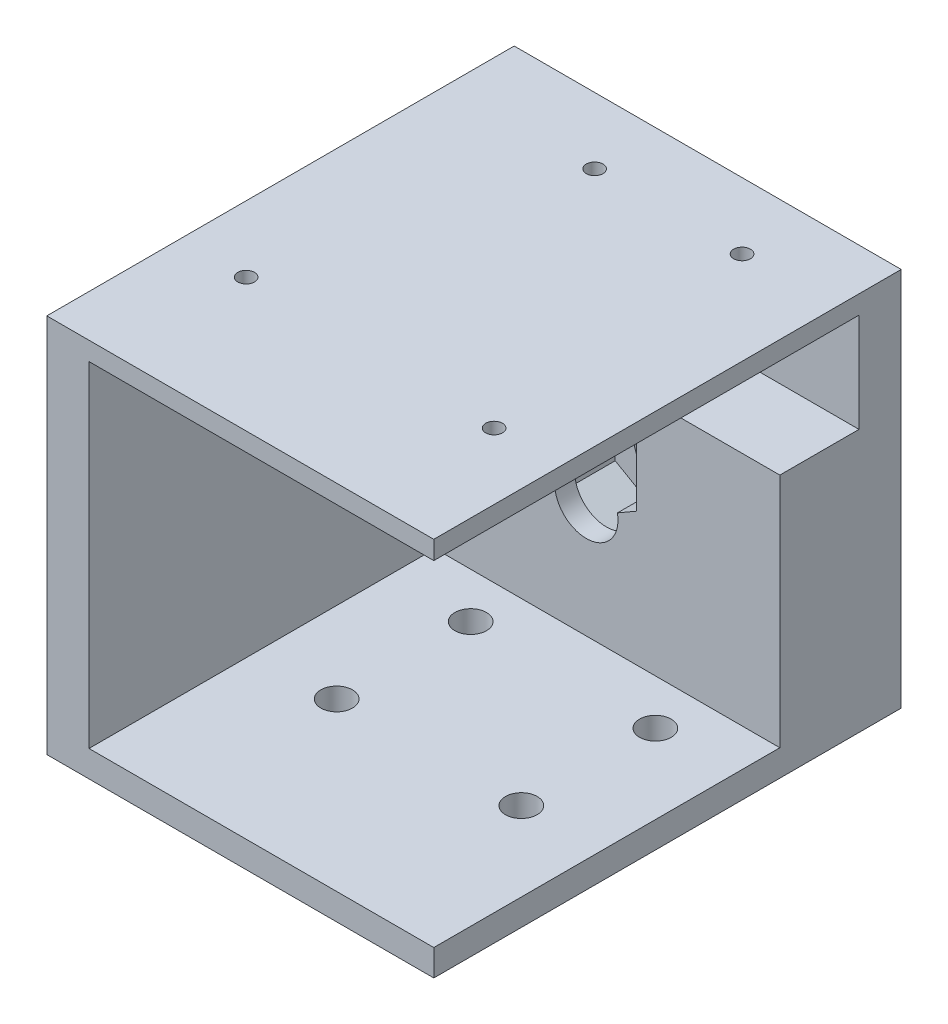
ISO-10303-21;
HEADER;
FILE_DESCRIPTION(('STEP AP214'),'2;1');
FILE_NAME('part.step','',(''),(''),'','','');
FILE_SCHEMA(('AUTOMOTIVE_DESIGN { 1 0 10303 214 1 1 1 1 }'));
ENDSEC;
DATA;
#1=APPLICATION_CONTEXT('core data for automotive mechanical design processes');
#2=APPLICATION_PROTOCOL_DEFINITION('international standard','automotive_design',2000,#1);
#3=PRODUCT_CONTEXT('',#1,'mechanical');
#4=PRODUCT('Part','Part','',(#3));
#5=PRODUCT_RELATED_PRODUCT_CATEGORY('part','',(#4));
#6=PRODUCT_DEFINITION_FORMATION('','',#4);
#7=PRODUCT_DEFINITION_CONTEXT('part definition',#1,'design');
#8=PRODUCT_DEFINITION('design','',#6,#7);
#9=PRODUCT_DEFINITION_SHAPE('','',#8);
#10=(LENGTH_UNIT() NAMED_UNIT(*) SI_UNIT(.MILLI.,.METRE.));
#11=(NAMED_UNIT(*) PLANE_ANGLE_UNIT() SI_UNIT($,.RADIAN.));
#12=(NAMED_UNIT(*) SI_UNIT($,.STERADIAN.) SOLID_ANGLE_UNIT());
#13=UNCERTAINTY_MEASURE_WITH_UNIT(LENGTH_MEASURE(1.E-05),#10,'distance_accuracy_value','');
#14=(GEOMETRIC_REPRESENTATION_CONTEXT(3) GLOBAL_UNCERTAINTY_ASSIGNED_CONTEXT((#13)) GLOBAL_UNIT_ASSIGNED_CONTEXT((#10,
#11,#12)) REPRESENTATION_CONTEXT('',''));
#15=CARTESIAN_POINT('',(0.,0.,0.));
#16=DIRECTION('',(0.,0.,1.));
#17=DIRECTION('',(1.,0.,0.));
#18=AXIS2_PLACEMENT_3D('',#15,#16,#17);
#19=CARTESIAN_POINT('',(-26.67,-45.,10.));
#20=DIRECTION('',(0.,0.,-1.));
#21=DIRECTION('',(-1.,0.,0.));
#22=AXIS2_PLACEMENT_3D('',#19,#20,#21);
#23=CYLINDRICAL_SURFACE('',#22,6.);
#24=CARTESIAN_POINT('',(-26.67,-45.,-78.58));
#25=DIRECTION('',(0.,0.,-1.));
#26=DIRECTION('',(-1.,0.,0.));
#27=AXIS2_PLACEMENT_3D('',#24,#25,#26);
#28=CIRCLE('',#27,6.);
#29=CARTESIAN_POINT('',(-32.67,-45.,-78.58));
#30=VERTEX_POINT('',#29);
#31=EDGE_CURVE('E218',#30,#30,#28,.T.);
#32=ORIENTED_EDGE('',*,*,#31,.T.);
#33=EDGE_LOOP('',(#32));
#34=FACE_BOUND('',#33,.T.);
#35=CARTESIAN_POINT('',(-26.67,-45.,-70.58));
#36=DIRECTION('',(0.,0.,1.));
#37=DIRECTION('',(1.,0.,0.));
#38=AXIS2_PLACEMENT_3D('',#35,#36,#37);
#39=CIRCLE('',#38,6.);
#40=CARTESIAN_POINT('',(-20.67,-45.,-70.58));
#41=VERTEX_POINT('',#40);
#42=EDGE_CURVE('E45',#41,#41,#39,.T.);
#43=ORIENTED_EDGE('',*,*,#42,.T.);
#44=EDGE_LOOP('',(#43));
#45=FACE_BOUND('',#44,.T.);
#46=ADVANCED_FACE('F37',(#34,#45),#23,.F.);
#47=CARTESIAN_POINT('',(0.,0.,-55.58));
#48=DIRECTION('',(0.,0.,1.));
#49=DIRECTION('',(1.,0.,0.));
#50=AXIS2_PLACEMENT_3D('',#47,#48,#49);
#51=PLANE('',#50);
#52=CARTESIAN_POINT('',(-26.67,-45.,-55.58));
#53=DIRECTION('',(0.,0.,1.));
#54=DIRECTION('',(1.,0.,0.));
#55=AXIS2_PLACEMENT_3D('',#52,#53,#54);
#56=CIRCLE('',#55,6.);
#57=CARTESIAN_POINT('',(-32.5582629183958,-43.8474550751296,-55.58));
#58=VERTEX_POINT('',#57);
#59=CARTESIAN_POINT('',(-20.7817370816041,-43.8474550751296,-55.58));
#60=VERTEX_POINT('',#59);
#61=EDGE_CURVE('E226',#58,#60,#56,.T.);
#62=ORIENTED_EDGE('',*,*,#61,.F.);
#63=DIRECTION('',(-0.866025403784439,0.5,0.));
#64=VECTOR('',#63,1.);
#65=CARTESIAN_POINT('',(-27.1260707227785,-46.9837327015591,-55.58));
#66=LINE('',#65,#64);
#67=CARTESIAN_POINT('',(-36.195,-41.7477839420936,-55.58));
#68=VERTEX_POINT('',#67);
#69=EDGE_CURVE('E52',#58,#68,#66,.T.);
#70=ORIENTED_EDGE('',*,*,#69,.T.);
#71=DIRECTION('',(0.,1.,0.));
#72=VECTOR('',#71,1.);
#73=CARTESIAN_POINT('',(-36.195,0.,-55.58));
#74=LINE('',#73,#72);
#75=CARTESIAN_POINT('',(-36.195,-30.7492613140312,-55.58));
#76=VERTEX_POINT('',#75);
#77=EDGE_CURVE('E375',#68,#76,#74,.T.);
#78=ORIENTED_EDGE('',*,*,#77,.T.);
#79=DIRECTION('',(0.866025403784439,0.5,0.));
#80=VECTOR('',#79,1.);
#81=CARTESIAN_POINT('',(4.26607072277854,-7.3890512405345,-55.58));
#82=LINE('',#81,#80);
#83=CARTESIAN_POINT('',(-26.67,-25.25,-55.58));
#84=VERTEX_POINT('',#83);
#85=EDGE_CURVE('E377',#76,#84,#82,.T.);
#86=ORIENTED_EDGE('',*,*,#85,.T.);
#87=DIRECTION('',(0.866025403784439,-0.5,0.));
#88=VECTOR('',#87,1.);
#89=CARTESIAN_POINT('',(-17.6010707227785,-30.4859487594655,-55.58));
#90=LINE('',#89,#88);
#91=CARTESIAN_POINT('',(-17.145,-30.7492613140312,-55.58));
#92=VERTEX_POINT('',#91);
#93=EDGE_CURVE('E380',#84,#92,#90,.T.);
#94=ORIENTED_EDGE('',*,*,#93,.T.);
#95=DIRECTION('',(0.,-1.,0.));
#96=VECTOR('',#95,1.);
#97=CARTESIAN_POINT('',(-17.145,0.,-55.58));
#98=LINE('',#97,#96);
#99=CARTESIAN_POINT('',(-17.145,-41.7477839420936,-55.58));
#100=VERTEX_POINT('',#99);
#101=EDGE_CURVE('E383',#92,#100,#98,.T.);
#102=ORIENTED_EDGE('',*,*,#101,.T.);
#103=DIRECTION('',(-0.866025403784439,-0.5,0.));
#104=VECTOR('',#103,1.);
#105=CARTESIAN_POINT('',(13.7910707227785,-23.8868351826281,-55.58));
#106=LINE('',#105,#104);
#107=EDGE_CURVE('E386',#100,#60,#106,.T.);
#108=ORIENTED_EDGE('',*,*,#107,.T.);
#109=EDGE_LOOP('',(#62,#70,#78,#86,#94,#102,#108));
#110=FACE_BOUND('',#109,.T.);
#111=DIRECTION('',(0.,1.,0.));
#112=VECTOR('',#111,1.);
#113=CARTESIAN_POINT('',(10.,-67.,-55.58));
#114=LINE('',#113,#112);
#115=CARTESIAN_POINT('',(10.,-67.,-55.58));
#116=VERTEX_POINT('',#115);
#117=CARTESIAN_POINT('',(10.,-22.25,-55.58));
#118=VERTEX_POINT('',#117);
#119=EDGE_CURVE('E249',#116,#118,#114,.T.);
#120=ORIENTED_EDGE('',*,*,#119,.T.);
#121=DIRECTION('',(-1.,0.,0.));
#122=VECTOR('',#121,1.);
#123=CARTESIAN_POINT('',(10.,-22.25,-55.58));
#124=LINE('',#123,#122);
#125=CARTESIAN_POINT('',(-55.34,-22.25,-55.58));
#126=VERTEX_POINT('',#125);
#127=EDGE_CURVE('E252',#118,#126,#124,.T.);
#128=ORIENTED_EDGE('',*,*,#127,.T.);
#129=DIRECTION('',(0.,-1.,0.));
#130=VECTOR('',#129,1.);
#131=CARTESIAN_POINT('',(-55.34,-67.,-55.58));
#132=LINE('',#131,#130);
#133=CARTESIAN_POINT('',(-55.34,-67.,-55.58));
#134=VERTEX_POINT('',#133);
#135=EDGE_CURVE('E255',#126,#134,#132,.T.);
#136=ORIENTED_EDGE('',*,*,#135,.T.);
#137=DIRECTION('',(1.,0.,0.));
#138=VECTOR('',#137,1.);
#139=CARTESIAN_POINT('',(10.,-67.,-55.58));
#140=LINE('',#139,#138);
#141=EDGE_CURVE('E258',#134,#116,#140,.T.);
#142=ORIENTED_EDGE('',*,*,#141,.T.);
#143=EDGE_LOOP('',(#120,#128,#136,#142));
#144=FACE_BOUND('',#143,.T.);
#145=ADVANCED_FACE('F407',(#110,#144),#51,.T.);
#146=CARTESIAN_POINT('',(-55.34,-67.,-70.58));
#147=DIRECTION('',(0.,0.,-1.));
#148=DIRECTION('',(-1.,0.,0.));
#149=AXIS2_PLACEMENT_3D('',#146,#147,#148);
#150=PLANE('',#149);
#151=DIRECTION('',(-1.,0.,0.));
#152=VECTOR('',#151,1.);
#153=CARTESIAN_POINT('',(10.,-22.25,-70.58));
#154=LINE('',#153,#152);
#155=CARTESIAN_POINT('',(10.,-22.25,-70.58));
#156=VERTEX_POINT('',#155);
#157=CARTESIAN_POINT('',(-55.34,-22.25,-70.58));
#158=VERTEX_POINT('',#157);
#159=EDGE_CURVE('E60',#156,#158,#154,.T.);
#160=ORIENTED_EDGE('',*,*,#159,.F.);
#161=DIRECTION('',(0.,1.,0.));
#162=VECTOR('',#161,1.);
#163=CARTESIAN_POINT('',(10.,-67.,-70.58));
#164=LINE('',#163,#162);
#165=CARTESIAN_POINT('',(10.,-3.5,-70.58));
#166=VERTEX_POINT('',#165);
#167=EDGE_CURVE('E323',#156,#166,#164,.T.);
#168=ORIENTED_EDGE('',*,*,#167,.T.);
#169=DIRECTION('',(-1.,0.,0.));
#170=VECTOR('',#169,1.);
#171=CARTESIAN_POINT('',(-55.34,-3.5,-70.58));
#172=LINE('',#171,#170);
#173=CARTESIAN_POINT('',(-55.34,-3.5,-70.58));
#174=VERTEX_POINT('',#173);
#175=EDGE_CURVE('E310',#166,#174,#172,.T.);
#176=ORIENTED_EDGE('',*,*,#175,.T.);
#177=DIRECTION('',(0.,1.,0.));
#178=VECTOR('',#177,1.);
#179=CARTESIAN_POINT('',(-55.34,-67.,-70.58));
#180=LINE('',#179,#178);
#181=EDGE_CURVE('E321',#158,#174,#180,.T.);
#182=ORIENTED_EDGE('',*,*,#181,.F.);
#183=EDGE_LOOP('',(#160,#168,#176,#182));
#184=FACE_BOUND('',#183,.T.);
#185=ADVANCED_FACE('F412',(#184),#150,.F.);
#186=CARTESIAN_POINT('',(-55.34,-67.,10.));
#187=DIRECTION('',(-1.,0.,0.));
#188=DIRECTION('',(0.,0.,1.));
#189=AXIS2_PLACEMENT_3D('',#186,#187,#188);
#190=PLANE('',#189);
#191=DIRECTION('',(0.,0.,-1.));
#192=VECTOR('',#191,1.);
#193=CARTESIAN_POINT('',(-55.34,-22.25,-55.58));
#194=LINE('',#193,#192);
#195=EDGE_CURVE('E261',#126,#158,#194,.T.);
#196=ORIENTED_EDGE('',*,*,#195,.T.);
#197=ORIENTED_EDGE('',*,*,#181,.T.);
#198=DIRECTION('',(0.,0.,1.));
#199=VECTOR('',#198,1.);
#200=CARTESIAN_POINT('',(-55.34,-3.5,10.));
#201=LINE('',#200,#199);
#202=CARTESIAN_POINT('',(-55.34,-3.5,10.));
#203=VERTEX_POINT('',#202);
#204=EDGE_CURVE('E314',#174,#203,#201,.T.);
#205=ORIENTED_EDGE('',*,*,#204,.T.);
#206=DIRECTION('',(0.,1.,0.));
#207=VECTOR('',#206,1.);
#208=CARTESIAN_POINT('',(-55.34,-67.,10.));
#209=LINE('',#208,#207);
#210=CARTESIAN_POINT('',(-55.34,-67.,10.));
#211=VERTEX_POINT('',#210);
#212=EDGE_CURVE('E313',#211,#203,#209,.T.);
#213=ORIENTED_EDGE('',*,*,#212,.F.);
#214=DIRECTION('',(0.,0.,1.));
#215=VECTOR('',#214,1.);
#216=CARTESIAN_POINT('',(-55.34,-67.,10.));
#217=LINE('',#216,#215);
#218=EDGE_CURVE('E311',#134,#211,#217,.T.);
#219=ORIENTED_EDGE('',*,*,#218,.F.);
#220=ORIENTED_EDGE('',*,*,#135,.F.);
#221=EDGE_LOOP('',(#196,#197,#205,#213,#219,#220));
#222=FACE_BOUND('',#221,.T.);
#223=ADVANCED_FACE('F570',(#222),#190,.F.);
#224=CARTESIAN_POINT('',(0.,-3.5,0.));
#225=DIRECTION('',(0.,1.,0.));
#226=DIRECTION('',(0.,0.,1.));
#227=AXIS2_PLACEMENT_3D('',#224,#225,#226);
#228=PLANE('',#227);
#229=CARTESIAN_POINT('',(-7.62,-3.5,-66.04));
#230=DIRECTION('',(0.,1.,0.));
#231=DIRECTION('',(0.,0.,1.));
#232=AXIS2_PLACEMENT_3D('',#229,#230,#231);
#233=CIRCLE('',#232,1.5875);
#234=CARTESIAN_POINT('',(-7.62,-3.5,-64.4525));
#235=VERTEX_POINT('',#234);
#236=EDGE_CURVE('E344',#235,#235,#233,.T.);
#237=ORIENTED_EDGE('',*,*,#236,.T.);
#238=EDGE_LOOP('',(#237));
#239=FACE_BOUND('',#238,.T.);
#240=CARTESIAN_POINT('',(-35.56,-3.5,-66.04));
#241=DIRECTION('',(0.,1.,0.));
#242=DIRECTION('',(0.,0.,1.));
#243=AXIS2_PLACEMENT_3D('',#240,#241,#242);
#244=CIRCLE('',#243,1.5875);
#245=CARTESIAN_POINT('',(-35.56,-3.5,-64.4525));
#246=VERTEX_POINT('',#245);
#247=EDGE_CURVE('E326',#246,#246,#244,.T.);
#248=ORIENTED_EDGE('',*,*,#247,.T.);
#249=EDGE_LOOP('',(#248));
#250=FACE_BOUND('',#249,.T.);
#251=CARTESIAN_POINT('',(-2.54,-3.5,-13.97));
#252=DIRECTION('',(0.,1.,0.));
#253=DIRECTION('',(0.,0.,1.));
#254=AXIS2_PLACEMENT_3D('',#251,#252,#253);
#255=CIRCLE('',#254,1.5875);
#256=CARTESIAN_POINT('',(-2.54,-3.5,-12.3825));
#257=VERTEX_POINT('',#256);
#258=EDGE_CURVE('E333',#257,#257,#255,.T.);
#259=ORIENTED_EDGE('',*,*,#258,.T.);
#260=EDGE_LOOP('',(#259));
#261=FACE_BOUND('',#260,.T.);
#262=CARTESIAN_POINT('',(-50.8,-3.5,-15.24));
#263=DIRECTION('',(0.,1.,0.));
#264=DIRECTION('',(0.,0.,1.));
#265=AXIS2_PLACEMENT_3D('',#262,#263,#264);
#266=CIRCLE('',#265,1.5875);
#267=CARTESIAN_POINT('',(-50.8,-3.5,-13.6525));
#268=VERTEX_POINT('',#267);
#269=EDGE_CURVE('E339',#268,#268,#266,.T.);
#270=ORIENTED_EDGE('',*,*,#269,.T.);
#271=EDGE_LOOP('',(#270));
#272=FACE_BOUND('',#271,.T.);
#273=ORIENTED_EDGE('',*,*,#204,.F.);
#274=ORIENTED_EDGE('',*,*,#175,.F.);
#275=DIRECTION('',(0.,0.,-1.));
#276=VECTOR('',#275,1.);
#277=CARTESIAN_POINT('',(10.,-3.5,10.));
#278=LINE('',#277,#276);
#279=CARTESIAN_POINT('',(10.,-3.5,10.));
#280=VERTEX_POINT('',#279);
#281=EDGE_CURVE('E350',#280,#166,#278,.T.);
#282=ORIENTED_EDGE('',*,*,#281,.F.);
#283=DIRECTION('',(1.,0.,0.));
#284=VECTOR('',#283,1.);
#285=CARTESIAN_POINT('',(10.,-3.5,10.));
#286=LINE('',#285,#284);
#287=EDGE_CURVE('E353',#203,#280,#286,.T.);
#288=ORIENTED_EDGE('',*,*,#287,.F.);
#289=EDGE_LOOP('',(#273,#274,#282,#288));
#290=FACE_BOUND('',#289,.T.);
#291=ADVANCED_FACE('F561',(#239,#250,#261,#272,#290),#228,.F.);
#292=CARTESIAN_POINT('',(10.,-3.5,10.));
#293=DIRECTION('',(1.,0.,0.));
#294=DIRECTION('',(0.,0.,-1.));
#295=AXIS2_PLACEMENT_3D('',#292,#293,#294);
#296=PLANE('',#295);
#297=ORIENTED_EDGE('',*,*,#167,.F.);
#298=DIRECTION('',(0.,0.,-1.));
#299=VECTOR('',#298,1.);
#300=CARTESIAN_POINT('',(10.,-22.25,-55.58));
#301=LINE('',#300,#299);
#302=EDGE_CURVE('E264',#118,#156,#301,.T.);
#303=ORIENTED_EDGE('',*,*,#302,.F.);
#304=ORIENTED_EDGE('',*,*,#119,.F.);
#305=DIRECTION('',(0.,0.,1.));
#306=VECTOR('',#305,1.);
#307=CARTESIAN_POINT('',(10.,-67.,-78.58));
#308=LINE('',#307,#306);
#309=CARTESIAN_POINT('',(10.,-67.,10.));
#310=VERTEX_POINT('',#309);
#311=EDGE_CURVE('E289',#116,#310,#308,.T.);
#312=ORIENTED_EDGE('',*,*,#311,.T.);
#313=DIRECTION('',(0.,1.,0.));
#314=VECTOR('',#313,1.);
#315=CARTESIAN_POINT('',(10.,-72.,10.));
#316=LINE('',#315,#314);
#317=CARTESIAN_POINT('',(10.,-72.,10.));
#318=VERTEX_POINT('',#317);
#319=EDGE_CURVE('E304',#318,#310,#316,.T.);
#320=ORIENTED_EDGE('',*,*,#319,.F.);
#321=DIRECTION('',(0.,0.,1.));
#322=VECTOR('',#321,1.);
#323=CARTESIAN_POINT('',(10.,-72.,-78.58));
#324=LINE('',#323,#322);
#325=CARTESIAN_POINT('',(10.,-72.,-78.58));
#326=VERTEX_POINT('',#325);
#327=EDGE_CURVE('E299',#326,#318,#324,.T.);
#328=ORIENTED_EDGE('',*,*,#327,.F.);
#329=DIRECTION('',(0.,1.,0.));
#330=VECTOR('',#329,1.);
#331=CARTESIAN_POINT('',(10.,-3.5,-78.58));
#332=LINE('',#331,#330);
#333=CARTESIAN_POINT('',(10.,0.,-78.58));
#334=VERTEX_POINT('',#333);
#335=EDGE_CURVE('E356',#326,#334,#332,.T.);
#336=ORIENTED_EDGE('',*,*,#335,.T.);
#337=DIRECTION('',(0.,0.,-1.));
#338=VECTOR('',#337,1.);
#339=CARTESIAN_POINT('',(10.,0.,10.));
#340=LINE('',#339,#338);
#341=CARTESIAN_POINT('',(10.,0.,10.));
#342=VERTEX_POINT('',#341);
#343=EDGE_CURVE('E347',#342,#334,#340,.T.);
#344=ORIENTED_EDGE('',*,*,#343,.F.);
#345=DIRECTION('',(0.,1.,0.));
#346=VECTOR('',#345,1.);
#347=CARTESIAN_POINT('',(10.,-3.5,10.));
#348=LINE('',#347,#346);
#349=EDGE_CURVE('E367',#280,#342,#348,.T.);
#350=ORIENTED_EDGE('',*,*,#349,.F.);
#351=ORIENTED_EDGE('',*,*,#281,.T.);
#352=EDGE_LOOP('',(#297,#303,#304,#312,#320,#328,#336,#344,#350,#351));
#353=FACE_BOUND('',#352,.T.);
#354=ADVANCED_FACE('F39',(#353),#296,.T.);
#355=CARTESIAN_POINT('',(10.,-3.5,10.));
#356=DIRECTION('',(0.,0.,1.));
#357=DIRECTION('',(1.,0.,0.));
#358=AXIS2_PLACEMENT_3D('',#355,#356,#357);
#359=PLANE('',#358);
#360=DIRECTION('',(1.,0.,0.));
#361=VECTOR('',#360,1.);
#362=CARTESIAN_POINT('',(10.,0.,10.));
#363=LINE('',#362,#361);
#364=CARTESIAN_POINT('',(-63.34,0.,10.));
#365=VERTEX_POINT('',#364);
#366=EDGE_CURVE('E354',#365,#342,#363,.T.);
#367=ORIENTED_EDGE('',*,*,#366,.F.);
#368=DIRECTION('',(0.,1.,0.));
#369=VECTOR('',#368,1.);
#370=CARTESIAN_POINT('',(-63.34,-3.5,10.));
#371=LINE('',#370,#369);
#372=CARTESIAN_POINT('',(-63.34,-72.,10.));
#373=VERTEX_POINT('',#372);
#374=EDGE_CURVE('E369',#373,#365,#371,.T.);
#375=ORIENTED_EDGE('',*,*,#374,.F.);
#376=DIRECTION('',(-1.,0.,0.));
#377=VECTOR('',#376,1.);
#378=CARTESIAN_POINT('',(-63.34,-72.,10.));
#379=LINE('',#378,#377);
#380=EDGE_CURVE('E301',#318,#373,#379,.T.);
#381=ORIENTED_EDGE('',*,*,#380,.F.);
#382=ORIENTED_EDGE('',*,*,#319,.T.);
#383=DIRECTION('',(-1.,0.,0.));
#384=VECTOR('',#383,1.);
#385=CARTESIAN_POINT('',(-63.34,-67.,10.));
#386=LINE('',#385,#384);
#387=EDGE_CURVE('E296',#310,#211,#386,.T.);
#388=ORIENTED_EDGE('',*,*,#387,.T.);
#389=ORIENTED_EDGE('',*,*,#212,.T.);
#390=ORIENTED_EDGE('',*,*,#287,.T.);
#391=ORIENTED_EDGE('',*,*,#349,.T.);
#392=EDGE_LOOP('',(#367,#375,#381,#382,#388,#389,#390,#391));
#393=FACE_BOUND('',#392,.T.);
#394=ADVANCED_FACE('F560',(#393),#359,.T.);
#395=CARTESIAN_POINT('',(-63.34,-3.5,10.));
#396=DIRECTION('',(-1.,0.,0.));
#397=DIRECTION('',(0.,0.,1.));
#398=AXIS2_PLACEMENT_3D('',#395,#396,#397);
#399=PLANE('',#398);
#400=DIRECTION('',(0.,0.,1.));
#401=VECTOR('',#400,1.);
#402=CARTESIAN_POINT('',(-63.34,0.,10.));
#403=LINE('',#402,#401);
#404=CARTESIAN_POINT('',(-63.34,0.,-78.58));
#405=VERTEX_POINT('',#404);
#406=EDGE_CURVE('E362',#405,#365,#403,.T.);
#407=ORIENTED_EDGE('',*,*,#406,.F.);
#408=DIRECTION('',(0.,1.,0.));
#409=VECTOR('',#408,1.);
#410=CARTESIAN_POINT('',(-63.34,-3.5,-78.58));
#411=LINE('',#410,#409);
#412=CARTESIAN_POINT('',(-63.34,-72.,-78.58));
#413=VERTEX_POINT('',#412);
#414=EDGE_CURVE('E371',#413,#405,#411,.T.);
#415=ORIENTED_EDGE('',*,*,#414,.F.);
#416=DIRECTION('',(0.,0.,-1.));
#417=VECTOR('',#416,1.);
#418=CARTESIAN_POINT('',(-63.34,-72.,-78.58));
#419=LINE('',#418,#417);
#420=EDGE_CURVE('E292',#373,#413,#419,.T.);
#421=ORIENTED_EDGE('',*,*,#420,.F.);
#422=ORIENTED_EDGE('',*,*,#374,.T.);
#423=EDGE_LOOP('',(#407,#415,#421,#422));
#424=FACE_BOUND('',#423,.T.);
#425=ADVANCED_FACE('F499',(#424),#399,.T.);
#426=CARTESIAN_POINT('',(10.,-3.5,-78.58));
#427=DIRECTION('',(0.,0.,-1.));
#428=DIRECTION('',(-1.,0.,0.));
#429=AXIS2_PLACEMENT_3D('',#426,#427,#428);
#430=PLANE('',#429);
#431=ORIENTED_EDGE('',*,*,#31,.F.);
#432=EDGE_LOOP('',(#431));
#433=FACE_BOUND('',#432,.T.);
#434=DIRECTION('',(-1.,0.,0.));
#435=VECTOR('',#434,1.);
#436=CARTESIAN_POINT('',(10.,0.,-78.58));
#437=LINE('',#436,#435);
#438=EDGE_CURVE('E359',#334,#405,#437,.T.);
#439=ORIENTED_EDGE('',*,*,#438,.F.);
#440=ORIENTED_EDGE('',*,*,#335,.F.);
#441=DIRECTION('',(1.,0.,0.));
#442=VECTOR('',#441,1.);
#443=CARTESIAN_POINT('',(-63.34,-72.,-78.58));
#444=LINE('',#443,#442);
#445=EDGE_CURVE('E295',#413,#326,#444,.T.);
#446=ORIENTED_EDGE('',*,*,#445,.F.);
#447=ORIENTED_EDGE('',*,*,#414,.T.);
#448=EDGE_LOOP('',(#439,#440,#446,#447));
#449=FACE_BOUND('',#448,.T.);
#450=ADVANCED_FACE('F493',(#433,#449),#430,.T.);
#451=CARTESIAN_POINT('',(0.,0.,0.));
#452=DIRECTION('',(0.,1.,0.));
#453=DIRECTION('',(0.,0.,1.));
#454=AXIS2_PLACEMENT_3D('',#451,#452,#453);
#455=PLANE('',#454);
#456=CARTESIAN_POINT('',(-50.8,0.,-15.24));
#457=DIRECTION('',(0.,1.,0.));
#458=DIRECTION('',(0.,0.,1.));
#459=AXIS2_PLACEMENT_3D('',#456,#457,#458);
#460=CIRCLE('',#459,1.5875);
#461=CARTESIAN_POINT('',(-50.8,0.,-13.6525));
#462=VERTEX_POINT('',#461);
#463=EDGE_CURVE('E325',#462,#462,#460,.T.);
#464=ORIENTED_EDGE('',*,*,#463,.F.);
#465=EDGE_LOOP('',(#464));
#466=FACE_BOUND('',#465,.T.);
#467=CARTESIAN_POINT('',(-2.54,0.,-13.97));
#468=DIRECTION('',(0.,1.,0.));
#469=DIRECTION('',(0.,0.,1.));
#470=AXIS2_PLACEMENT_3D('',#467,#468,#469);
#471=CIRCLE('',#470,1.5875);
#472=CARTESIAN_POINT('',(-2.54,0.,-12.3825));
#473=VERTEX_POINT('',#472);
#474=EDGE_CURVE('E336',#473,#473,#471,.T.);
#475=ORIENTED_EDGE('',*,*,#474,.F.);
#476=EDGE_LOOP('',(#475));
#477=FACE_BOUND('',#476,.T.);
#478=CARTESIAN_POINT('',(-35.56,0.,-66.04));
#479=DIRECTION('',(0.,1.,0.));
#480=DIRECTION('',(0.,0.,1.));
#481=AXIS2_PLACEMENT_3D('',#478,#479,#480);
#482=CIRCLE('',#481,1.5875);
#483=CARTESIAN_POINT('',(-35.56,0.,-64.4525));
#484=VERTEX_POINT('',#483);
#485=EDGE_CURVE('E330',#484,#484,#482,.T.);
#486=ORIENTED_EDGE('',*,*,#485,.F.);
#487=EDGE_LOOP('',(#486));
#488=FACE_BOUND('',#487,.T.);
#489=CARTESIAN_POINT('',(-7.62,0.,-66.04));
#490=DIRECTION('',(0.,1.,0.));
#491=DIRECTION('',(0.,0.,1.));
#492=AXIS2_PLACEMENT_3D('',#489,#490,#491);
#493=CIRCLE('',#492,1.5875);
#494=CARTESIAN_POINT('',(-7.62,0.,-64.4525));
#495=VERTEX_POINT('',#494);
#496=EDGE_CURVE('E329',#495,#495,#493,.T.);
#497=ORIENTED_EDGE('',*,*,#496,.F.);
#498=EDGE_LOOP('',(#497));
#499=FACE_BOUND('',#498,.T.);
#500=ORIENTED_EDGE('',*,*,#343,.T.);
#501=ORIENTED_EDGE('',*,*,#438,.T.);
#502=ORIENTED_EDGE('',*,*,#406,.T.);
#503=ORIENTED_EDGE('',*,*,#366,.T.);
#504=EDGE_LOOP('',(#500,#501,#502,#503));
#505=FACE_BOUND('',#504,.T.);
#506=ADVANCED_FACE('F498',(#466,#477,#488,#499,#505),#455,.T.);
#507=CARTESIAN_POINT('',(-7.62,-3.5,-66.04));
#508=DIRECTION('',(0.,1.,0.));
#509=DIRECTION('',(0.,0.,1.));
#510=AXIS2_PLACEMENT_3D('',#507,#508,#509);
#511=CYLINDRICAL_SURFACE('',#510,1.5875);
#512=ORIENTED_EDGE('',*,*,#236,.F.);
#513=EDGE_LOOP('',(#512));
#514=FACE_BOUND('',#513,.T.);
#515=ORIENTED_EDGE('',*,*,#496,.T.);
#516=EDGE_LOOP('',(#515));
#517=FACE_BOUND('',#516,.T.);
#518=ADVANCED_FACE('F679',(#514,#517),#511,.F.);
#519=CARTESIAN_POINT('',(-35.56,-3.5,-66.04));
#520=DIRECTION('',(0.,1.,0.));
#521=DIRECTION('',(0.,0.,1.));
#522=AXIS2_PLACEMENT_3D('',#519,#520,#521);
#523=CYLINDRICAL_SURFACE('',#522,1.5875);
#524=ORIENTED_EDGE('',*,*,#247,.F.);
#525=EDGE_LOOP('',(#524));
#526=FACE_BOUND('',#525,.T.);
#527=ORIENTED_EDGE('',*,*,#485,.T.);
#528=EDGE_LOOP('',(#527));
#529=FACE_BOUND('',#528,.T.);
#530=ADVANCED_FACE('F669',(#526,#529),#523,.F.);
#531=CARTESIAN_POINT('',(-2.54,-3.5,-13.97));
#532=DIRECTION('',(0.,1.,0.));
#533=DIRECTION('',(0.,0.,1.));
#534=AXIS2_PLACEMENT_3D('',#531,#532,#533);
#535=CYLINDRICAL_SURFACE('',#534,1.5875);
#536=ORIENTED_EDGE('',*,*,#258,.F.);
#537=EDGE_LOOP('',(#536));
#538=FACE_BOUND('',#537,.T.);
#539=ORIENTED_EDGE('',*,*,#474,.T.);
#540=EDGE_LOOP('',(#539));
#541=FACE_BOUND('',#540,.T.);
#542=ADVANCED_FACE('F659',(#538,#541),#535,.F.);
#543=CARTESIAN_POINT('',(-50.8,-3.5,-15.24));
#544=DIRECTION('',(0.,1.,0.));
#545=DIRECTION('',(0.,0.,1.));
#546=AXIS2_PLACEMENT_3D('',#543,#544,#545);
#547=CYLINDRICAL_SURFACE('',#546,1.5875);
#548=ORIENTED_EDGE('',*,*,#269,.F.);
#549=EDGE_LOOP('',(#548));
#550=FACE_BOUND('',#549,.T.);
#551=ORIENTED_EDGE('',*,*,#463,.T.);
#552=EDGE_LOOP('',(#551));
#553=FACE_BOUND('',#552,.T.);
#554=ADVANCED_FACE('F623',(#550,#553),#547,.F.);
#555=CARTESIAN_POINT('',(0.,-72.,0.));
#556=DIRECTION('',(0.,1.,0.));
#557=DIRECTION('',(0.,0.,1.));
#558=AXIS2_PLACEMENT_3D('',#555,#556,#557);
#559=PLANE('',#558);
#560=CARTESIAN_POINT('',(-4.99999999999999,-72.,-46.99));
#561=DIRECTION('',(0.,-1.,0.));
#562=DIRECTION('',(0.,0.,-1.));
#563=AXIS2_PLACEMENT_3D('',#560,#561,#562);
#564=CIRCLE('',#563,3.);
#565=CARTESIAN_POINT('',(-4.99999999999999,-72.,-49.99));
#566=VERTEX_POINT('',#565);
#567=EDGE_CURVE('E278',#566,#566,#564,.T.);
#568=ORIENTED_EDGE('',*,*,#567,.F.);
#569=EDGE_LOOP('',(#568));
#570=FACE_BOUND('',#569,.T.);
#571=CARTESIAN_POINT('',(-40.,-72.,-21.59));
#572=DIRECTION('',(0.,-1.,0.));
#573=DIRECTION('',(0.,0.,-1.));
#574=AXIS2_PLACEMENT_3D('',#571,#572,#573);
#575=CIRCLE('',#574,3.);
#576=CARTESIAN_POINT('',(-40.,-72.,-24.59));
#577=VERTEX_POINT('',#576);
#578=EDGE_CURVE('E271',#577,#577,#575,.T.);
#579=ORIENTED_EDGE('',*,*,#578,.F.);
#580=EDGE_LOOP('',(#579));
#581=FACE_BOUND('',#580,.T.);
#582=CARTESIAN_POINT('',(-40.,-72.,-46.99));
#583=DIRECTION('',(0.,-1.,0.));
#584=DIRECTION('',(0.,0.,-1.));
#585=AXIS2_PLACEMENT_3D('',#582,#583,#584);
#586=CIRCLE('',#585,3.);
#587=CARTESIAN_POINT('',(-40.,-72.,-49.99));
#588=VERTEX_POINT('',#587);
#589=EDGE_CURVE('E267',#588,#588,#586,.T.);
#590=ORIENTED_EDGE('',*,*,#589,.F.);
#591=EDGE_LOOP('',(#590));
#592=FACE_BOUND('',#591,.T.);
#593=CARTESIAN_POINT('',(-4.99999999999999,-72.,-21.59));
#594=DIRECTION('',(0.,-1.,0.));
#595=DIRECTION('',(0.,0.,-1.));
#596=AXIS2_PLACEMENT_3D('',#593,#594,#595);
#597=CIRCLE('',#596,3.);
#598=CARTESIAN_POINT('',(-4.99999999999999,-72.,-24.59));
#599=VERTEX_POINT('',#598);
#600=EDGE_CURVE('E277',#599,#599,#597,.T.);
#601=ORIENTED_EDGE('',*,*,#600,.F.);
#602=EDGE_LOOP('',(#601));
#603=FACE_BOUND('',#602,.T.);
#604=ORIENTED_EDGE('',*,*,#420,.T.);
#605=ORIENTED_EDGE('',*,*,#445,.T.);
#606=ORIENTED_EDGE('',*,*,#327,.T.);
#607=ORIENTED_EDGE('',*,*,#380,.T.);
#608=EDGE_LOOP('',(#604,#605,#606,#607));
#609=FACE_BOUND('',#608,.T.);
#610=ADVANCED_FACE('F548',(#570,#581,#592,#603,#609),#559,.F.);
#611=CARTESIAN_POINT('',(0.,-67.,0.));
#612=DIRECTION('',(0.,1.,0.));
#613=DIRECTION('',(0.,0.,1.));
#614=AXIS2_PLACEMENT_3D('',#611,#612,#613);
#615=PLANE('',#614);
#616=ORIENTED_EDGE('',*,*,#141,.F.);
#617=ORIENTED_EDGE('',*,*,#218,.T.);
#618=ORIENTED_EDGE('',*,*,#387,.F.);
#619=ORIENTED_EDGE('',*,*,#311,.F.);
#620=EDGE_LOOP('',(#616,#617,#618,#619));
#621=FACE_BOUND('',#620,.T.);
#622=CARTESIAN_POINT('',(-4.99999999999999,-67.,-46.99));
#623=DIRECTION('',(0.,-1.,0.));
#624=DIRECTION('',(0.,0.,-1.));
#625=AXIS2_PLACEMENT_3D('',#622,#623,#624);
#626=CIRCLE('',#625,3.);
#627=CARTESIAN_POINT('',(-4.99999999999999,-67.,-49.99));
#628=VERTEX_POINT('',#627);
#629=EDGE_CURVE('E274',#628,#628,#626,.T.);
#630=ORIENTED_EDGE('',*,*,#629,.T.);
#631=EDGE_LOOP('',(#630));
#632=FACE_BOUND('',#631,.T.);
#633=CARTESIAN_POINT('',(-40.,-67.,-21.59));
#634=DIRECTION('',(0.,-1.,0.));
#635=DIRECTION('',(0.,0.,-1.));
#636=AXIS2_PLACEMENT_3D('',#633,#634,#635);
#637=CIRCLE('',#636,3.);
#638=CARTESIAN_POINT('',(-40.,-67.,-24.59));
#639=VERTEX_POINT('',#638);
#640=EDGE_CURVE('E281',#639,#639,#637,.T.);
#641=ORIENTED_EDGE('',*,*,#640,.T.);
#642=EDGE_LOOP('',(#641));
#643=FACE_BOUND('',#642,.T.);
#644=CARTESIAN_POINT('',(-40.,-67.,-46.99));
#645=DIRECTION('',(0.,-1.,0.));
#646=DIRECTION('',(0.,0.,-1.));
#647=AXIS2_PLACEMENT_3D('',#644,#645,#646);
#648=CIRCLE('',#647,3.);
#649=CARTESIAN_POINT('',(-40.,-67.,-49.99));
#650=VERTEX_POINT('',#649);
#651=EDGE_CURVE('E268',#650,#650,#648,.T.);
#652=ORIENTED_EDGE('',*,*,#651,.T.);
#653=EDGE_LOOP('',(#652));
#654=FACE_BOUND('',#653,.T.);
#655=CARTESIAN_POINT('',(-4.99999999999999,-67.,-21.59));
#656=DIRECTION('',(0.,-1.,0.));
#657=DIRECTION('',(0.,0.,-1.));
#658=AXIS2_PLACEMENT_3D('',#655,#656,#657);
#659=CIRCLE('',#658,3.);
#660=CARTESIAN_POINT('',(-4.99999999999999,-67.,-24.59));
#661=VERTEX_POINT('',#660);
#662=EDGE_CURVE('E286',#661,#661,#659,.T.);
#663=ORIENTED_EDGE('',*,*,#662,.T.);
#664=EDGE_LOOP('',(#663));
#665=FACE_BOUND('',#664,.T.);
#666=ADVANCED_FACE('F542',(#621,#632,#643,#654,#665),#615,.T.);
#667=CARTESIAN_POINT('',(-4.99999999999999,-67.,-21.59));
#668=DIRECTION('',(0.,-1.,0.));
#669=DIRECTION('',(0.,0.,-1.));
#670=AXIS2_PLACEMENT_3D('',#667,#668,#669);
#671=CYLINDRICAL_SURFACE('',#670,3.);
#672=ORIENTED_EDGE('',*,*,#662,.F.);
#673=EDGE_LOOP('',(#672));
#674=FACE_BOUND('',#673,.T.);
#675=ORIENTED_EDGE('',*,*,#600,.T.);
#676=EDGE_LOOP('',(#675));
#677=FACE_BOUND('',#676,.T.);
#678=ADVANCED_FACE('F547',(#674,#677),#671,.F.);
#679=CARTESIAN_POINT('',(-40.,-67.,-46.99));
#680=DIRECTION('',(0.,-1.,0.));
#681=DIRECTION('',(0.,0.,-1.));
#682=AXIS2_PLACEMENT_3D('',#679,#680,#681);
#683=CYLINDRICAL_SURFACE('',#682,3.);
#684=ORIENTED_EDGE('',*,*,#651,.F.);
#685=EDGE_LOOP('',(#684));
#686=FACE_BOUND('',#685,.T.);
#687=ORIENTED_EDGE('',*,*,#589,.T.);
#688=EDGE_LOOP('',(#687));
#689=FACE_BOUND('',#688,.T.);
#690=ADVANCED_FACE('F599',(#686,#689),#683,.F.);
#691=CARTESIAN_POINT('',(-40.,-67.,-21.59));
#692=DIRECTION('',(0.,-1.,0.));
#693=DIRECTION('',(0.,0.,-1.));
#694=AXIS2_PLACEMENT_3D('',#691,#692,#693);
#695=CYLINDRICAL_SURFACE('',#694,3.);
#696=ORIENTED_EDGE('',*,*,#640,.F.);
#697=EDGE_LOOP('',(#696));
#698=FACE_BOUND('',#697,.T.);
#699=ORIENTED_EDGE('',*,*,#578,.T.);
#700=EDGE_LOOP('',(#699));
#701=FACE_BOUND('',#700,.T.);
#702=ADVANCED_FACE('F589',(#698,#701),#695,.F.);
#703=CARTESIAN_POINT('',(-4.99999999999999,-67.,-46.99));
#704=DIRECTION('',(0.,-1.,0.));
#705=DIRECTION('',(0.,0.,-1.));
#706=AXIS2_PLACEMENT_3D('',#703,#704,#705);
#707=CYLINDRICAL_SURFACE('',#706,3.);
#708=ORIENTED_EDGE('',*,*,#629,.F.);
#709=EDGE_LOOP('',(#708));
#710=FACE_BOUND('',#709,.T.);
#711=ORIENTED_EDGE('',*,*,#567,.T.);
#712=EDGE_LOOP('',(#711));
#713=FACE_BOUND('',#712,.T.);
#714=ADVANCED_FACE('F534',(#710,#713),#707,.F.);
#715=CARTESIAN_POINT('',(10.,-22.25,-55.58));
#716=DIRECTION('',(0.,-1.,0.));
#717=DIRECTION('',(1.,0.,0.));
#718=AXIS2_PLACEMENT_3D('',#715,#716,#717);
#719=PLANE('',#718);
#720=ORIENTED_EDGE('',*,*,#159,.T.);
#721=ORIENTED_EDGE('',*,*,#195,.F.);
#722=ORIENTED_EDGE('',*,*,#127,.F.);
#723=ORIENTED_EDGE('',*,*,#302,.T.);
#724=EDGE_LOOP('',(#720,#721,#722,#723));
#725=FACE_BOUND('',#724,.T.);
#726=ADVANCED_FACE('F481',(#725),#719,.F.);
#727=CARTESIAN_POINT('',(-26.67,-47.2470452561248,10.));
#728=DIRECTION('',(-0.5,0.866025403784439,0.));
#729=DIRECTION('',(-0.866025403784439,-0.5,0.));
#730=AXIS2_PLACEMENT_3D('',#727,#728,#729);
#731=PLANE('',#730);
#732=DIRECTION('',(0.866025403784439,0.5,0.));
#733=VECTOR('',#732,1.);
#734=CARTESIAN_POINT('',(-26.67,-47.2470452561248,-59.38));
#735=LINE('',#734,#733);
#736=CARTESIAN_POINT('',(-20.7817370816041,-43.8474550751296,-59.38));
#737=VERTEX_POINT('',#736);
#738=CARTESIAN_POINT('',(-17.145,-41.7477839420936,-59.38));
#739=VERTEX_POINT('',#738);
#740=EDGE_CURVE('E216',#737,#739,#735,.T.);
#741=ORIENTED_EDGE('',*,*,#740,.F.);
#742=DIRECTION('',(0.,0.,-1.));
#743=VECTOR('',#742,1.);
#744=CARTESIAN_POINT('',(-20.7817370816041,-43.8474550751296,10.));
#745=LINE('',#744,#743);
#746=EDGE_CURVE('E223',#60,#737,#745,.T.);
#747=ORIENTED_EDGE('',*,*,#746,.F.);
#748=ORIENTED_EDGE('',*,*,#107,.F.);
#749=DIRECTION('',(0.,0.,-1.));
#750=VECTOR('',#749,1.);
#751=CARTESIAN_POINT('',(-17.145,-41.7477839420936,10.));
#752=LINE('',#751,#750);
#753=EDGE_CURVE('E246',#100,#739,#752,.T.);
#754=ORIENTED_EDGE('',*,*,#753,.T.);
#755=EDGE_LOOP('',(#741,#747,#748,#754));
#756=FACE_BOUND('',#755,.T.);
#757=ADVANCED_FACE('F470',(#756),#731,.T.);
#758=CARTESIAN_POINT('',(-17.145,-41.7477839420936,10.));
#759=DIRECTION('',(-1.,0.,0.));
#760=DIRECTION('',(0.,0.,1.));
#761=AXIS2_PLACEMENT_3D('',#758,#759,#760);
#762=PLANE('',#761);
#763=DIRECTION('',(0.,0.,-1.));
#764=VECTOR('',#763,1.);
#765=CARTESIAN_POINT('',(-17.145,-30.7492613140312,10.));
#766=LINE('',#765,#764);
#767=CARTESIAN_POINT('',(-17.145,-30.7492613140312,-70.58));
#768=VERTEX_POINT('',#767);
#769=EDGE_CURVE('E243',#92,#768,#766,.T.);
#770=ORIENTED_EDGE('',*,*,#769,.T.);
#771=DIRECTION('',(0.,1.,0.));
#772=VECTOR('',#771,1.);
#773=CARTESIAN_POINT('',(-17.145,-41.7477839420936,-70.58));
#774=LINE('',#773,#772);
#775=CARTESIAN_POINT('',(-17.145,-50.4992613140312,-70.58));
#776=VERTEX_POINT('',#775);
#777=EDGE_CURVE('E228',#776,#768,#774,.T.);
#778=ORIENTED_EDGE('',*,*,#777,.F.);
#779=DIRECTION('',(0.,0.,-1.));
#780=VECTOR('',#779,1.);
#781=CARTESIAN_POINT('',(-17.145,-50.4992613140312,-59.38));
#782=LINE('',#781,#780);
#783=CARTESIAN_POINT('',(-17.145,-50.4992613140312,-59.38));
#784=VERTEX_POINT('',#783);
#785=EDGE_CURVE('E204',#784,#776,#782,.T.);
#786=ORIENTED_EDGE('',*,*,#785,.F.);
#787=DIRECTION('',(0.,1.,0.));
#788=VECTOR('',#787,1.);
#789=CARTESIAN_POINT('',(-17.145,-50.4992613140312,-59.38));
#790=LINE('',#789,#788);
#791=EDGE_CURVE('E189',#784,#739,#790,.T.);
#792=ORIENTED_EDGE('',*,*,#791,.T.);
#793=ORIENTED_EDGE('',*,*,#753,.F.);
#794=ORIENTED_EDGE('',*,*,#101,.F.);
#795=EDGE_LOOP('',(#770,#778,#786,#792,#793,#794));
#796=FACE_BOUND('',#795,.T.);
#797=ADVANCED_FACE('F465',(#796),#762,.T.);
#798=CARTESIAN_POINT('',(-17.145,-30.7492613140312,10.));
#799=DIRECTION('',(-0.5,-0.866025403784439,0.));
#800=DIRECTION('',(0.866025403784439,-0.5,0.));
#801=AXIS2_PLACEMENT_3D('',#798,#799,#800);
#802=PLANE('',#801);
#803=DIRECTION('',(0.,0.,-1.));
#804=VECTOR('',#803,1.);
#805=CARTESIAN_POINT('',(-26.67,-25.25,10.));
#806=LINE('',#805,#804);
#807=CARTESIAN_POINT('',(-26.67,-25.25,-70.58));
#808=VERTEX_POINT('',#807);
#809=EDGE_CURVE('E241',#84,#808,#806,.T.);
#810=ORIENTED_EDGE('',*,*,#809,.T.);
#811=DIRECTION('',(-0.866025403784439,0.5,0.));
#812=VECTOR('',#811,1.);
#813=CARTESIAN_POINT('',(-17.145,-30.7492613140312,-70.58));
#814=LINE('',#813,#812);
#815=EDGE_CURVE('E230',#768,#808,#814,.T.);
#816=ORIENTED_EDGE('',*,*,#815,.F.);
#817=ORIENTED_EDGE('',*,*,#769,.F.);
#818=ORIENTED_EDGE('',*,*,#93,.F.);
#819=EDGE_LOOP('',(#810,#816,#817,#818));
#820=FACE_BOUND('',#819,.T.);
#821=ADVANCED_FACE('F469',(#820),#802,.T.);
#822=CARTESIAN_POINT('',(-26.67,-25.25,10.));
#823=DIRECTION('',(0.5,-0.866025403784439,0.));
#824=DIRECTION('',(0.866025403784439,0.5,0.));
#825=AXIS2_PLACEMENT_3D('',#822,#823,#824);
#826=PLANE('',#825);
#827=DIRECTION('',(0.,0.,-1.));
#828=VECTOR('',#827,1.);
#829=CARTESIAN_POINT('',(-36.195,-30.7492613140312,10.));
#830=LINE('',#829,#828);
#831=CARTESIAN_POINT('',(-36.195,-30.7492613140312,-70.58));
#832=VERTEX_POINT('',#831);
#833=EDGE_CURVE('E239',#76,#832,#830,.T.);
#834=ORIENTED_EDGE('',*,*,#833,.T.);
#835=DIRECTION('',(-0.866025403784439,-0.5,0.));
#836=VECTOR('',#835,1.);
#837=CARTESIAN_POINT('',(-26.67,-25.25,-70.58));
#838=LINE('',#837,#836);
#839=EDGE_CURVE('E233',#808,#832,#838,.T.);
#840=ORIENTED_EDGE('',*,*,#839,.F.);
#841=ORIENTED_EDGE('',*,*,#809,.F.);
#842=ORIENTED_EDGE('',*,*,#85,.F.);
#843=EDGE_LOOP('',(#834,#840,#841,#842));
#844=FACE_BOUND('',#843,.T.);
#845=ADVANCED_FACE('F458',(#844),#826,.T.);
#846=CARTESIAN_POINT('',(-36.195,-30.7492613140312,10.));
#847=DIRECTION('',(1.,0.,0.));
#848=DIRECTION('',(0.,0.,-1.));
#849=AXIS2_PLACEMENT_3D('',#846,#847,#848);
#850=PLANE('',#849);
#851=DIRECTION('',(0.,0.,-1.));
#852=VECTOR('',#851,1.);
#853=CARTESIAN_POINT('',(-36.195,-50.4992613140312,-59.38));
#854=LINE('',#853,#852);
#855=CARTESIAN_POINT('',(-36.195,-50.4992613140312,-59.38));
#856=VERTEX_POINT('',#855);
#857=CARTESIAN_POINT('',(-36.195,-50.4992613140312,-70.58));
#858=VERTEX_POINT('',#857);
#859=EDGE_CURVE('E181',#856,#858,#854,.T.);
#860=ORIENTED_EDGE('',*,*,#859,.T.);
#861=DIRECTION('',(0.,-1.,0.));
#862=VECTOR('',#861,1.);
#863=CARTESIAN_POINT('',(-36.195,-30.7492613140312,-70.58));
#864=LINE('',#863,#862);
#865=EDGE_CURVE('E236',#832,#858,#864,.T.);
#866=ORIENTED_EDGE('',*,*,#865,.F.);
#867=ORIENTED_EDGE('',*,*,#833,.F.);
#868=ORIENTED_EDGE('',*,*,#77,.F.);
#869=DIRECTION('',(0.,0.,-1.));
#870=VECTOR('',#869,1.);
#871=CARTESIAN_POINT('',(-36.195,-41.7477839420936,10.));
#872=LINE('',#871,#870);
#873=CARTESIAN_POINT('',(-36.195,-41.7477839420936,-59.38));
#874=VERTEX_POINT('',#873);
#875=EDGE_CURVE('E184',#68,#874,#872,.T.);
#876=ORIENTED_EDGE('',*,*,#875,.T.);
#877=DIRECTION('',(0.,-1.,0.));
#878=VECTOR('',#877,1.);
#879=CARTESIAN_POINT('',(-36.195,-39.5007386859688,-59.38));
#880=LINE('',#879,#878);
#881=EDGE_CURVE('E177',#874,#856,#880,.T.);
#882=ORIENTED_EDGE('',*,*,#881,.T.);
#883=EDGE_LOOP('',(#860,#866,#867,#868,#876,#882));
#884=FACE_BOUND('',#883,.T.);
#885=ADVANCED_FACE('F179',(#884),#850,.T.);
#886=CARTESIAN_POINT('',(-36.195,-41.7477839420936,10.));
#887=DIRECTION('',(0.5,0.866025403784439,0.));
#888=DIRECTION('',(-0.866025403784439,0.5,0.));
#889=AXIS2_PLACEMENT_3D('',#886,#887,#888);
#890=PLANE('',#889);
#891=DIRECTION('',(0.866025403784439,-0.5,0.));
#892=VECTOR('',#891,1.);
#893=CARTESIAN_POINT('',(-36.195,-41.7477839420936,-59.38));
#894=LINE('',#893,#892);
#895=CARTESIAN_POINT('',(-32.5582629183958,-43.8474550751296,-59.38));
#896=VERTEX_POINT('',#895);
#897=EDGE_CURVE('E196',#874,#896,#894,.T.);
#898=ORIENTED_EDGE('',*,*,#897,.F.);
#899=ORIENTED_EDGE('',*,*,#875,.F.);
#900=ORIENTED_EDGE('',*,*,#69,.F.);
#901=DIRECTION('',(0.,0.,-1.));
#902=VECTOR('',#901,1.);
#903=CARTESIAN_POINT('',(-32.5582629183958,-43.8474550751296,10.));
#904=LINE('',#903,#902);
#905=EDGE_CURVE('E221',#896,#58,#904,.F.);
#906=ORIENTED_EDGE('',*,*,#905,.F.);
#907=EDGE_LOOP('',(#898,#899,#900,#906));
#908=FACE_BOUND('',#907,.T.);
#909=ADVANCED_FACE('F395',(#908),#890,.T.);
#910=CARTESIAN_POINT('',(0.,0.,-70.58));
#911=DIRECTION('',(0.,0.,1.));
#912=DIRECTION('',(1.,0.,0.));
#913=AXIS2_PLACEMENT_3D('',#910,#911,#912);
#914=PLANE('',#913);
#915=DIRECTION('',(0.866025403784439,0.5,0.));
#916=VECTOR('',#915,1.);
#917=CARTESIAN_POINT('',(-26.67,-55.9985226280624,-70.58));
#918=LINE('',#917,#916);
#919=CARTESIAN_POINT('',(-26.67,-55.9985226280624,-70.58));
#920=VERTEX_POINT('',#919);
#921=EDGE_CURVE('E209',#920,#776,#918,.T.);
#922=ORIENTED_EDGE('',*,*,#921,.T.);
#923=ORIENTED_EDGE('',*,*,#777,.T.);
#924=ORIENTED_EDGE('',*,*,#815,.T.);
#925=ORIENTED_EDGE('',*,*,#839,.T.);
#926=ORIENTED_EDGE('',*,*,#865,.T.);
#927=DIRECTION('',(0.866025403784439,-0.5,0.));
#928=VECTOR('',#927,1.);
#929=CARTESIAN_POINT('',(-36.195,-50.4992613140312,-70.58));
#930=LINE('',#929,#928);
#931=EDGE_CURVE('E195',#858,#920,#930,.T.);
#932=ORIENTED_EDGE('',*,*,#931,.T.);
#933=EDGE_LOOP('',(#922,#923,#924,#925,#926,#932));
#934=FACE_BOUND('',#933,.T.);
#935=ORIENTED_EDGE('',*,*,#42,.F.);
#936=EDGE_LOOP('',(#935));
#937=FACE_BOUND('',#936,.T.);
#938=ADVANCED_FACE('F392',(#934,#937),#914,.T.);
#939=ORIENTED_EDGE('',*,*,#746,.T.);
#940=CARTESIAN_POINT('',(-26.67,-45.,-59.38));
#941=DIRECTION('',(0.,0.,1.));
#942=DIRECTION('',(1.,0.,0.));
#943=AXIS2_PLACEMENT_3D('',#940,#941,#942);
#944=CIRCLE('',#943,6.);
#945=EDGE_CURVE('E11',#737,#896,#944,.F.);
#946=ORIENTED_EDGE('',*,*,#945,.T.);
#947=ORIENTED_EDGE('',*,*,#905,.T.);
#948=ORIENTED_EDGE('',*,*,#61,.T.);
#949=EDGE_LOOP('',(#939,#946,#947,#948));
#950=FACE_BOUND('',#949,.T.);
#951=ADVANCED_FACE('F394',(#950),#23,.F.);
#952=CARTESIAN_POINT('',(-36.195,-50.4992613140312,-59.38));
#953=DIRECTION('',(0.5,0.866025403784439,0.));
#954=DIRECTION('',(-0.866025403784439,0.5,0.));
#955=AXIS2_PLACEMENT_3D('',#952,#953,#954);
#956=PLANE('',#955);
#957=ORIENTED_EDGE('',*,*,#931,.F.);
#958=ORIENTED_EDGE('',*,*,#859,.F.);
#959=DIRECTION('',(0.866025403784439,-0.5,0.));
#960=VECTOR('',#959,1.);
#961=CARTESIAN_POINT('',(-36.195,-50.4992613140312,-59.38));
#962=LINE('',#961,#960);
#963=CARTESIAN_POINT('',(-26.67,-55.9985226280624,-59.38));
#964=VERTEX_POINT('',#963);
#965=EDGE_CURVE('E188',#856,#964,#962,.T.);
#966=ORIENTED_EDGE('',*,*,#965,.T.);
#967=DIRECTION('',(0.,0.,-1.));
#968=VECTOR('',#967,1.);
#969=CARTESIAN_POINT('',(-26.67,-55.9985226280624,-59.38));
#970=LINE('',#969,#968);
#971=EDGE_CURVE('E197',#964,#920,#970,.T.);
#972=ORIENTED_EDGE('',*,*,#971,.T.);
#973=EDGE_LOOP('',(#957,#958,#966,#972));
#974=FACE_BOUND('',#973,.T.);
#975=ADVANCED_FACE('F192',(#974),#956,.T.);
#976=CARTESIAN_POINT('',(-26.67,-55.9985226280624,-59.38));
#977=DIRECTION('',(-0.5,0.866025403784439,0.));
#978=DIRECTION('',(-0.866025403784439,-0.5,0.));
#979=AXIS2_PLACEMENT_3D('',#976,#977,#978);
#980=PLANE('',#979);
#981=ORIENTED_EDGE('',*,*,#921,.F.);
#982=ORIENTED_EDGE('',*,*,#971,.F.);
#983=DIRECTION('',(0.866025403784439,0.5,0.));
#984=VECTOR('',#983,1.);
#985=CARTESIAN_POINT('',(-26.67,-55.9985226280624,-59.38));
#986=LINE('',#985,#984);
#987=EDGE_CURVE('E202',#964,#784,#986,.T.);
#988=ORIENTED_EDGE('',*,*,#987,.T.);
#989=ORIENTED_EDGE('',*,*,#785,.T.);
#990=EDGE_LOOP('',(#981,#982,#988,#989));
#991=FACE_BOUND('',#990,.T.);
#992=ADVANCED_FACE('F417',(#991),#980,.T.);
#993=CARTESIAN_POINT('',(0.,0.,-59.38));
#994=DIRECTION('',(0.,0.,1.));
#995=DIRECTION('',(1.,0.,0.));
#996=AXIS2_PLACEMENT_3D('',#993,#994,#995);
#997=PLANE('',#996);
#998=ORIENTED_EDGE('',*,*,#740,.T.);
#999=ORIENTED_EDGE('',*,*,#791,.F.);
#1000=ORIENTED_EDGE('',*,*,#987,.F.);
#1001=ORIENTED_EDGE('',*,*,#965,.F.);
#1002=ORIENTED_EDGE('',*,*,#881,.F.);
#1003=ORIENTED_EDGE('',*,*,#897,.T.);
#1004=ORIENTED_EDGE('',*,*,#945,.F.);
#1005=EDGE_LOOP('',(#998,#999,#1000,#1001,#1002,#1003,#1004));
#1006=FACE_BOUND('',#1005,.T.);
#1007=ADVANCED_FACE('F200',(#1006),#997,.F.);
#1008=CLOSED_SHELL('',(#46,#145,#185,#223,#291,#354,#394,#425,#450,#506,#518,#530,#542,#554,
#610,#666,#678,#690,#702,#714,#726,#757,#797,#821,#845,#885,#909,#938,#951,#975,#992,#1007));
#1009=MANIFOLD_SOLID_BREP('B2',#1008);
#1010=ADVANCED_BREP_SHAPE_REPRESENTATION('',(#18,#1009),#14);
#1011=SHAPE_DEFINITION_REPRESENTATION(#9,#1010);
ENDSEC;
END-ISO-10303-21;
